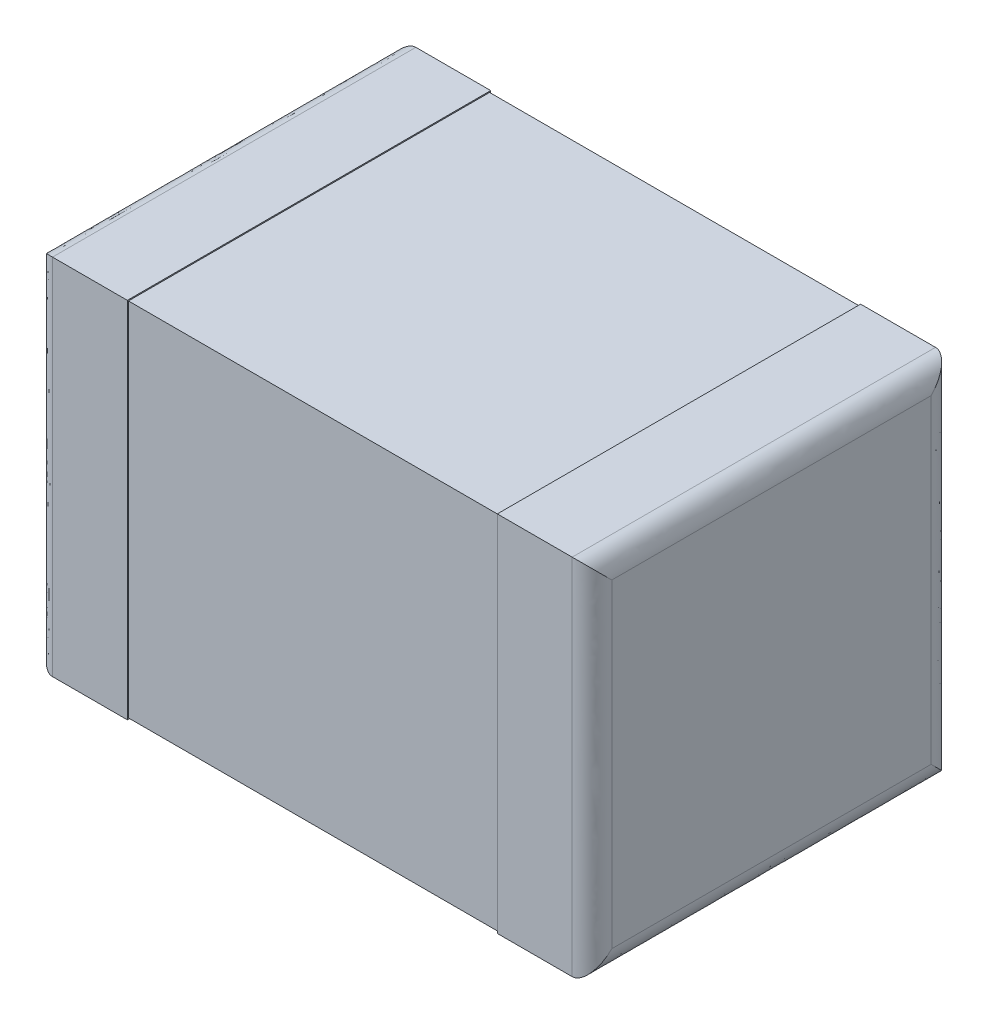
ISO-10303-21;
HEADER;
FILE_DESCRIPTION(('STEP AP214'),'2;1');
FILE_NAME('part.step','',(''),(''),'','','');
FILE_SCHEMA(('AUTOMOTIVE_DESIGN { 1 0 10303 214 1 1 1 1 }'));
ENDSEC;
DATA;
#1=APPLICATION_CONTEXT('core data for automotive mechanical design processes');
#2=APPLICATION_PROTOCOL_DEFINITION('international standard','automotive_design',2000,#1);
#3=PRODUCT_CONTEXT('',#1,'mechanical');
#4=PRODUCT('Part','Part','',(#3));
#5=PRODUCT_RELATED_PRODUCT_CATEGORY('part','',(#4));
#6=PRODUCT_DEFINITION_FORMATION('','',#4);
#7=PRODUCT_DEFINITION_CONTEXT('part definition',#1,'design');
#8=PRODUCT_DEFINITION('design','',#6,#7);
#9=PRODUCT_DEFINITION_SHAPE('','',#8);
#10=(LENGTH_UNIT() NAMED_UNIT(*) SI_UNIT(.MILLI.,.METRE.));
#11=(NAMED_UNIT(*) PLANE_ANGLE_UNIT() SI_UNIT($,.RADIAN.));
#12=(NAMED_UNIT(*) SI_UNIT($,.STERADIAN.) SOLID_ANGLE_UNIT());
#13=UNCERTAINTY_MEASURE_WITH_UNIT(LENGTH_MEASURE(1.E-05),#10,'distance_accuracy_value','');
#14=(GEOMETRIC_REPRESENTATION_CONTEXT(3) GLOBAL_UNCERTAINTY_ASSIGNED_CONTEXT((#13)) GLOBAL_UNIT_ASSIGNED_CONTEXT((#10,
#11,#12)) REPRESENTATION_CONTEXT('',''));
#15=CARTESIAN_POINT('',(0.,0.,0.));
#16=DIRECTION('',(0.,0.,1.));
#17=DIRECTION('',(1.,0.,0.));
#18=AXIS2_PLACEMENT_3D('',#15,#16,#17);
#19=CARTESIAN_POINT('',(1.23952,0.8382,0.838200109553));
#20=CARTESIAN_POINT('',(1.23952,0.8382,-1.095530181017E-07));
#21=CARTESIAN_POINT('',(1.28016,0.838199999999999,0.838200109553001));
#22=CARTESIAN_POINT('',(1.28016,0.838199999999999,-1.095530181017E-07));
#23=CARTESIAN_POINT('',(1.28016,0.7874,0.838200109553));
#24=CARTESIAN_POINT('',(1.28016,0.7874,-1.095530181017E-07));
#25=(BOUNDED_SURFACE() B_SPLINE_SURFACE(2,1,((#19,#20),(#21,#22),(#23,#24)),.UNSPECIFIED.,.F.,
.F.,.F.) B_SPLINE_SURFACE_WITH_KNOTS((3,3),(2,2),(1.570796326795,3.14159265359),
(-1.095530180276E-07,0.838200109553),
.UNSPECIFIED.) GEOMETRIC_REPRESENTATION_ITEM() RATIONAL_B_SPLINE_SURFACE(((1.,1.),
(0.707106781187,0.707106781187),(1.,1.))) REPRESENTATION_ITEM('') SURFACE());
#26=CARTESIAN_POINT('',(1.28016,0.7874,0.7874));
#27=CARTESIAN_POINT('',(1.28016,0.838199999999999,0.838199999999999));
#28=CARTESIAN_POINT('',(1.23952,0.8382,0.8382));
#29=(BOUNDED_CURVE() B_SPLINE_CURVE(2,(#26,#27,#28),.UNSPECIFIED.,.F.,
.F.) B_SPLINE_CURVE_WITH_KNOTS((3,3),(1.570796326795,3.14159265359),
.UNSPECIFIED.) CURVE() GEOMETRIC_REPRESENTATION_ITEM() RATIONAL_B_SPLINE_CURVE((1.,
0.707106781187,1.)) REPRESENTATION_ITEM(''));
#30=CARTESIAN_POINT('',(1.28016,0.7874,0.7874));
#31=VERTEX_POINT('',#30);
#32=CARTESIAN_POINT('',(1.23952,0.8382,0.8382));
#33=VERTEX_POINT('',#32);
#34=EDGE_CURVE('E27',#31,#33,#29,.T.);
#35=DIRECTION('',(0.,0.,-1.));
#36=VECTOR('',#35,1.);
#37=CARTESIAN_POINT('',(1.28016,0.7874,0.4191));
#38=LINE('',#37,#36);
#39=CARTESIAN_POINT('',(1.28016,0.7874,0.0508));
#40=VERTEX_POINT('',#39);
#41=EDGE_CURVE('E171',#31,#40,#38,.T.);
#42=CARTESIAN_POINT('',(1.28016,0.7874,0.0508));
#43=CARTESIAN_POINT('',(1.28016,0.838199999999999,0.));
#44=CARTESIAN_POINT('',(1.23952,0.8382,0.));
#45=(BOUNDED_CURVE() B_SPLINE_CURVE(2,(#42,#43,#44),.UNSPECIFIED.,.F.,
.F.) B_SPLINE_CURVE_WITH_KNOTS((3,3),(4.712388980385,6.28318530718),
.UNSPECIFIED.) CURVE() GEOMETRIC_REPRESENTATION_ITEM() RATIONAL_B_SPLINE_CURVE((1.,
0.707106781187,1.)) REPRESENTATION_ITEM(''));
#46=CARTESIAN_POINT('',(1.23952,0.8382,0.));
#47=VERTEX_POINT('',#46);
#48=EDGE_CURVE('E11',#40,#47,#45,.T.);
#49=DIRECTION('',(0.,0.,-1.));
#50=VECTOR('',#49,1.);
#51=CARTESIAN_POINT('',(1.23952,0.8382,0.4191));
#52=LINE('',#51,#50);
#53=EDGE_CURVE('E168',#33,#47,#52,.T.);
#54=ORIENTED_EDGE('',*,*,#34,.F.);
#55=ORIENTED_EDGE('',*,*,#41,.T.);
#56=ORIENTED_EDGE('',*,*,#48,.T.);
#57=ORIENTED_EDGE('',*,*,#53,.F.);
#58=EDGE_LOOP('',(#54,#55,#56,#57));
#59=FACE_BOUND('',#58,.T.);
#60=ADVANCED_FACE('F17',(#59),#25,.T.);
#61=CARTESIAN_POINT('',(1.28016,-1.095530180179E-07,0.0508));
#62=CARTESIAN_POINT('',(1.28016,0.838200109553,0.0508));
#63=CARTESIAN_POINT('',(1.28016,-1.095530180179E-07,0.));
#64=CARTESIAN_POINT('',(1.28016,0.838200109553001,0.));
#65=CARTESIAN_POINT('',(1.23952,-1.095530180179E-07,0.));
#66=CARTESIAN_POINT('',(1.23952,0.838200109553,0.));
#67=(BOUNDED_SURFACE() B_SPLINE_SURFACE(2,1,((#61,#62),(#63,#64),(#65,#66)),.UNSPECIFIED.,.F.,
.F.,.F.) B_SPLINE_SURFACE_WITH_KNOTS((3,3),(2,2),(1.570796326795,3.14159265359),
(-1.095530180179E-07,0.838200109553),
.UNSPECIFIED.) GEOMETRIC_REPRESENTATION_ITEM() RATIONAL_B_SPLINE_SURFACE(((1.,1.),
(0.707106781187,0.707106781187),(1.,1.))) REPRESENTATION_ITEM('') SURFACE());
#68=CARTESIAN_POINT('',(1.28016,0.0508,0.0508));
#69=CARTESIAN_POINT('',(1.28016,0.,0.));
#70=CARTESIAN_POINT('',(1.23952,0.,0.));
#71=(BOUNDED_CURVE() B_SPLINE_CURVE(2,(#68,#69,#70),.UNSPECIFIED.,.F.,
.F.) B_SPLINE_CURVE_WITH_KNOTS((3,3),(4.712388980385,6.28318530718),
.UNSPECIFIED.) CURVE() GEOMETRIC_REPRESENTATION_ITEM() RATIONAL_B_SPLINE_CURVE((1.,
0.707106781187,1.)) REPRESENTATION_ITEM(''));
#72=CARTESIAN_POINT('',(1.28016,0.0508,0.0508));
#73=VERTEX_POINT('',#72);
#74=CARTESIAN_POINT('',(1.23952,0.,0.));
#75=VERTEX_POINT('',#74);
#76=EDGE_CURVE('E189',#73,#75,#71,.T.);
#77=DIRECTION('',(0.,1.,0.));
#78=VECTOR('',#77,1.);
#79=CARTESIAN_POINT('',(1.23952,0.4191,0.));
#80=LINE('',#79,#78);
#81=EDGE_CURVE('E187',#75,#47,#80,.T.);
#82=DIRECTION('',(0.,1.,0.));
#83=VECTOR('',#82,1.);
#84=CARTESIAN_POINT('',(1.28016,0.4191,0.0508));
#85=LINE('',#84,#83);
#86=EDGE_CURVE('E367',#73,#40,#85,.T.);
#87=ORIENTED_EDGE('',*,*,#76,.T.);
#88=ORIENTED_EDGE('',*,*,#81,.T.);
#89=ORIENTED_EDGE('',*,*,#48,.F.);
#90=ORIENTED_EDGE('',*,*,#86,.F.);
#91=EDGE_LOOP('',(#87,#88,#89,#90));
#92=FACE_BOUND('',#91,.T.);
#93=ADVANCED_FACE('F188',(#92),#67,.T.);
#94=CARTESIAN_POINT('',(1.28016,0.838200109553,0.7874));
#95=CARTESIAN_POINT('',(1.28016,-1.095530180153E-07,0.7874));
#96=CARTESIAN_POINT('',(1.28016,0.838200109553001,0.838199999999999));
#97=CARTESIAN_POINT('',(1.28016,-1.095530180153E-07,0.838199999999999));
#98=CARTESIAN_POINT('',(1.23952,0.838200109553,0.8382));
#99=CARTESIAN_POINT('',(1.23952,-1.095530180153E-07,0.8382));
#100=(BOUNDED_SURFACE() B_SPLINE_SURFACE(2,1,((#94,#95),(#96,#97),(#98,#99)),.UNSPECIFIED.,.F.,
.F.,.F.) B_SPLINE_SURFACE_WITH_KNOTS((3,3),(2,2),(1.570796326795,3.14159265359),
(-0.838200109553,1.095530180153E-07),
.UNSPECIFIED.) GEOMETRIC_REPRESENTATION_ITEM() RATIONAL_B_SPLINE_SURFACE(((1.,1.),
(0.707106781187,0.707106781187),(1.,1.))) REPRESENTATION_ITEM('') SURFACE());
#101=CARTESIAN_POINT('',(1.28016,0.0508,0.7874));
#102=CARTESIAN_POINT('',(1.28016,0.,0.838199999999999));
#103=CARTESIAN_POINT('',(1.23952,0.,0.8382));
#104=(BOUNDED_CURVE() B_SPLINE_CURVE(2,(#101,#102,#103),.UNSPECIFIED.,.F.,
.F.) B_SPLINE_CURVE_WITH_KNOTS((3,3),(1.570796326795,3.14159265359),
.UNSPECIFIED.) CURVE() GEOMETRIC_REPRESENTATION_ITEM() RATIONAL_B_SPLINE_CURVE((1.,
0.707106781187,1.)) REPRESENTATION_ITEM(''));
#105=CARTESIAN_POINT('',(1.28016,0.0508,0.7874));
#106=VERTEX_POINT('',#105);
#107=CARTESIAN_POINT('',(1.23952,0.,0.8382));
#108=VERTEX_POINT('',#107);
#109=EDGE_CURVE('E40',#106,#108,#104,.T.);
#110=DIRECTION('',(0.,1.,0.));
#111=VECTOR('',#110,1.);
#112=CARTESIAN_POINT('',(1.28016,0.4191,0.7874));
#113=LINE('',#112,#111);
#114=EDGE_CURVE('E277',#106,#31,#113,.T.);
#115=DIRECTION('',(0.,1.,0.));
#116=VECTOR('',#115,1.);
#117=CARTESIAN_POINT('',(1.23952,0.4191,0.8382));
#118=LINE('',#117,#116);
#119=EDGE_CURVE('E339',#108,#33,#118,.T.);
#120=ORIENTED_EDGE('',*,*,#109,.F.);
#121=ORIENTED_EDGE('',*,*,#114,.T.);
#122=ORIENTED_EDGE('',*,*,#34,.T.);
#123=ORIENTED_EDGE('',*,*,#119,.F.);
#124=EDGE_LOOP('',(#120,#121,#122,#123));
#125=FACE_BOUND('',#124,.T.);
#126=ADVANCED_FACE('F641',(#125),#100,.T.);
#127=CARTESIAN_POINT('',(1.28016,0.0508,0.838200109553));
#128=CARTESIAN_POINT('',(1.28016,0.0508,-1.095530181017E-07));
#129=CARTESIAN_POINT('',(1.28016,0.,0.838200109553001));
#130=CARTESIAN_POINT('',(1.28016,0.,-1.095530181017E-07));
#131=CARTESIAN_POINT('',(1.23952,0.,0.838200109553));
#132=CARTESIAN_POINT('',(1.23952,0.,-1.095530181017E-07));
#133=(BOUNDED_SURFACE() B_SPLINE_SURFACE(2,1,((#127,#128),(#129,#130),(#131,#132)),
.UNSPECIFIED.,.F.,.F.,.F.) B_SPLINE_SURFACE_WITH_KNOTS((3,3),(2,2),(3.14159265359,
4.712388980385),(-1.095530180276E-07,0.838200109553),
.UNSPECIFIED.) GEOMETRIC_REPRESENTATION_ITEM() RATIONAL_B_SPLINE_SURFACE(((1.,1.),
(0.707106781187,0.707106781187),(1.,1.))) REPRESENTATION_ITEM('') SURFACE());
#134=DIRECTION('',(0.,0.,-1.));
#135=VECTOR('',#134,1.);
#136=CARTESIAN_POINT('',(1.28016,0.0508,0.4191));
#137=LINE('',#136,#135);
#138=EDGE_CURVE('E280',#106,#73,#137,.T.);
#139=DIRECTION('',(0.,0.,-1.));
#140=VECTOR('',#139,1.);
#141=CARTESIAN_POINT('',(1.23952,0.,0.4191));
#142=LINE('',#141,#140);
#143=EDGE_CURVE('E225',#108,#75,#142,.T.);
#144=ORIENTED_EDGE('',*,*,#76,.F.);
#145=ORIENTED_EDGE('',*,*,#138,.F.);
#146=ORIENTED_EDGE('',*,*,#109,.T.);
#147=ORIENTED_EDGE('',*,*,#143,.T.);
#148=EDGE_LOOP('',(#144,#145,#146,#147));
#149=FACE_BOUND('',#148,.T.);
#150=ADVANCED_FACE('F630',(#149),#133,.T.);
#151=CARTESIAN_POINT('',(0.04064,0.,0.838200109553));
#152=CARTESIAN_POINT('',(0.04064,0.,-1.095530181017E-07));
#153=CARTESIAN_POINT('',(0.,0.,0.838200109553001));
#154=CARTESIAN_POINT('',(0.,0.,-1.095530181017E-07));
#155=CARTESIAN_POINT('',(0.,0.0508,0.838200109553));
#156=CARTESIAN_POINT('',(0.,0.0508,-1.095530181017E-07));
#157=(BOUNDED_SURFACE() B_SPLINE_SURFACE(2,1,((#151,#152),(#153,#154),(#155,#156)),
.UNSPECIFIED.,.F.,.F.,.F.) B_SPLINE_SURFACE_WITH_KNOTS((3,3),(2,2),(4.712388980385,
6.28318530718),(-1.095530180276E-07,0.838200109553),
.UNSPECIFIED.) GEOMETRIC_REPRESENTATION_ITEM() RATIONAL_B_SPLINE_SURFACE(((1.,1.),
(0.707106781187,0.707106781187),(1.,1.))) REPRESENTATION_ITEM('') SURFACE());
#158=CARTESIAN_POINT('',(0.,0.0508,0.7874));
#159=CARTESIAN_POINT('',(0.,0.,0.838199999999999));
#160=CARTESIAN_POINT('',(0.04064,0.,0.8382));
#161=(BOUNDED_CURVE() B_SPLINE_CURVE(2,(#158,#159,#160),.UNSPECIFIED.,.F.,
.F.) B_SPLINE_CURVE_WITH_KNOTS((3,3),(1.570796326795,3.14159265359),
.UNSPECIFIED.) CURVE() GEOMETRIC_REPRESENTATION_ITEM() RATIONAL_B_SPLINE_CURVE((1.,
0.707106781187,1.)) REPRESENTATION_ITEM(''));
#162=CARTESIAN_POINT('',(0.,0.0508,0.7874));
#163=VERTEX_POINT('',#162);
#164=CARTESIAN_POINT('',(0.04064,0.,0.8382));
#165=VERTEX_POINT('',#164);
#166=EDGE_CURVE('E400',#163,#165,#161,.T.);
#167=DIRECTION('',(0.,0.,-1.));
#168=VECTOR('',#167,1.);
#169=CARTESIAN_POINT('',(0.,0.0508,0.4191));
#170=LINE('',#169,#168);
#171=CARTESIAN_POINT('',(0.,0.0508,0.0508));
#172=VERTEX_POINT('',#171);
#173=EDGE_CURVE('E330',#163,#172,#170,.T.);
#174=CARTESIAN_POINT('',(0.,0.0508,0.0508));
#175=CARTESIAN_POINT('',(0.,0.,0.));
#176=CARTESIAN_POINT('',(0.04064,0.,0.));
#177=(BOUNDED_CURVE() B_SPLINE_CURVE(2,(#174,#175,#176),.UNSPECIFIED.,.F.,
.F.) B_SPLINE_CURVE_WITH_KNOTS((3,3),(4.712388980385,6.28318530718),
.UNSPECIFIED.) CURVE() GEOMETRIC_REPRESENTATION_ITEM() RATIONAL_B_SPLINE_CURVE((1.,
0.707106781187,1.)) REPRESENTATION_ITEM(''));
#178=CARTESIAN_POINT('',(0.04064,0.,0.));
#179=VERTEX_POINT('',#178);
#180=EDGE_CURVE('E377',#172,#179,#177,.T.);
#181=DIRECTION('',(0.,0.,-1.));
#182=VECTOR('',#181,1.);
#183=CARTESIAN_POINT('',(0.04064,0.,0.4191));
#184=LINE('',#183,#182);
#185=EDGE_CURVE('E235',#165,#179,#184,.T.);
#186=ORIENTED_EDGE('',*,*,#166,.F.);
#187=ORIENTED_EDGE('',*,*,#173,.T.);
#188=ORIENTED_EDGE('',*,*,#180,.T.);
#189=ORIENTED_EDGE('',*,*,#185,.F.);
#190=EDGE_LOOP('',(#186,#187,#188,#189));
#191=FACE_BOUND('',#190,.T.);
#192=ADVANCED_FACE('F619',(#191),#157,.T.);
#193=CARTESIAN_POINT('',(0.,0.838200109553,0.0508));
#194=CARTESIAN_POINT('',(0.,-1.095530181017E-07,0.0508));
#195=CARTESIAN_POINT('',(0.,0.838200109553001,0.));
#196=CARTESIAN_POINT('',(0.,-1.095530181017E-07,0.));
#197=CARTESIAN_POINT('',(0.04064,0.838200109553,0.));
#198=CARTESIAN_POINT('',(0.04064,-1.095530181017E-07,0.));
#199=(BOUNDED_SURFACE() B_SPLINE_SURFACE(2,1,((#193,#194),(#195,#196),(#197,#198)),
.UNSPECIFIED.,.F.,.F.,.F.) B_SPLINE_SURFACE_WITH_KNOTS((3,3),(2,2),(3.14159265359,
4.712388980385),(-1.095530180288E-07,0.838200109553),
.UNSPECIFIED.) GEOMETRIC_REPRESENTATION_ITEM() RATIONAL_B_SPLINE_SURFACE(((1.,1.),
(0.707106781187,0.707106781187),(1.,1.))) REPRESENTATION_ITEM('') SURFACE());
#200=CARTESIAN_POINT('',(0.,0.7874,0.0508));
#201=CARTESIAN_POINT('',(0.,0.838199999999999,0.));
#202=CARTESIAN_POINT('',(0.04064,0.8382,0.));
#203=(BOUNDED_CURVE() B_SPLINE_CURVE(2,(#200,#201,#202),.UNSPECIFIED.,.F.,
.F.) B_SPLINE_CURVE_WITH_KNOTS((3,3),(4.712388980385,6.28318530718),
.UNSPECIFIED.) CURVE() GEOMETRIC_REPRESENTATION_ITEM() RATIONAL_B_SPLINE_CURVE((1.,
0.707106781187,1.)) REPRESENTATION_ITEM(''));
#204=CARTESIAN_POINT('',(0.,0.7874,0.0508));
#205=VERTEX_POINT('',#204);
#206=CARTESIAN_POINT('',(0.04064,0.8382,0.));
#207=VERTEX_POINT('',#206);
#208=EDGE_CURVE('E353',#205,#207,#203,.T.);
#209=DIRECTION('',(0.,-1.,0.));
#210=VECTOR('',#209,1.);
#211=CARTESIAN_POINT('',(0.04064,0.4191,0.));
#212=LINE('',#211,#210);
#213=EDGE_CURVE('E223',#207,#179,#212,.T.);
#214=DIRECTION('',(0.,-1.,0.));
#215=VECTOR('',#214,1.);
#216=CARTESIAN_POINT('',(0.,0.4191,0.0508));
#217=LINE('',#216,#215);
#218=EDGE_CURVE('E326',#205,#172,#217,.T.);
#219=ORIENTED_EDGE('',*,*,#208,.T.);
#220=ORIENTED_EDGE('',*,*,#213,.T.);
#221=ORIENTED_EDGE('',*,*,#180,.F.);
#222=ORIENTED_EDGE('',*,*,#218,.F.);
#223=EDGE_LOOP('',(#219,#220,#221,#222));
#224=FACE_BOUND('',#223,.T.);
#225=ADVANCED_FACE('F608',(#224),#199,.T.);
#226=CARTESIAN_POINT('',(0.,-1.095530180156E-07,0.7874));
#227=CARTESIAN_POINT('',(0.,0.838200109553,0.7874));
#228=CARTESIAN_POINT('',(0.,-1.095530180156E-07,0.838199999999999));
#229=CARTESIAN_POINT('',(0.,0.838200109553001,0.838199999999999));
#230=CARTESIAN_POINT('',(0.04064,-1.095530180153E-07,0.8382));
#231=CARTESIAN_POINT('',(0.04064,0.838200109553,0.8382));
#232=(BOUNDED_SURFACE() B_SPLINE_SURFACE(2,1,((#226,#227),(#228,#229),(#230,#231)),
.UNSPECIFIED.,.F.,.F.,.F.) B_SPLINE_SURFACE_WITH_KNOTS((3,3),(2,2),(0.,1.570796326795),
(-1.095530180156E-07,0.838200109553),
.UNSPECIFIED.) GEOMETRIC_REPRESENTATION_ITEM() RATIONAL_B_SPLINE_SURFACE(((1.,1.),
(0.707106781187,0.707106781187),(1.,1.))) REPRESENTATION_ITEM('') SURFACE());
#233=CARTESIAN_POINT('',(0.,0.7874,0.7874));
#234=CARTESIAN_POINT('',(0.,0.838199999999999,0.838199999999999));
#235=CARTESIAN_POINT('',(0.04064,0.8382,0.8382));
#236=(BOUNDED_CURVE() B_SPLINE_CURVE(2,(#233,#234,#235),.UNSPECIFIED.,.F.,
.F.) B_SPLINE_CURVE_WITH_KNOTS((3,3),(1.570796326795,3.14159265359),
.UNSPECIFIED.) CURVE() GEOMETRIC_REPRESENTATION_ITEM() RATIONAL_B_SPLINE_CURVE((1.,
0.707106781187,1.)) REPRESENTATION_ITEM(''));
#237=CARTESIAN_POINT('',(0.,0.7874,0.7874));
#238=VERTEX_POINT('',#237);
#239=CARTESIAN_POINT('',(0.04064,0.8382,0.8382));
#240=VERTEX_POINT('',#239);
#241=EDGE_CURVE('E356',#238,#240,#236,.T.);
#242=DIRECTION('',(0.,-1.,0.));
#243=VECTOR('',#242,1.);
#244=CARTESIAN_POINT('',(0.,0.4191,0.7874));
#245=LINE('',#244,#243);
#246=EDGE_CURVE('E351',#238,#163,#245,.T.);
#247=DIRECTION('',(0.,-1.,0.));
#248=VECTOR('',#247,1.);
#249=CARTESIAN_POINT('',(0.04064,0.4191,0.8382));
#250=LINE('',#249,#248);
#251=EDGE_CURVE('E242',#240,#165,#250,.T.);
#252=ORIENTED_EDGE('',*,*,#241,.F.);
#253=ORIENTED_EDGE('',*,*,#246,.T.);
#254=ORIENTED_EDGE('',*,*,#166,.T.);
#255=ORIENTED_EDGE('',*,*,#251,.F.);
#256=EDGE_LOOP('',(#252,#253,#254,#255));
#257=FACE_BOUND('',#256,.T.);
#258=ADVANCED_FACE('F597',(#257),#232,.T.);
#259=CARTESIAN_POINT('',(0.,0.7874,0.838200109553));
#260=CARTESIAN_POINT('',(0.,0.7874,-1.095530181017E-07));
#261=CARTESIAN_POINT('',(0.,0.838199999999999,0.838200109553001));
#262=CARTESIAN_POINT('',(0.,0.838199999999999,-1.095530181017E-07));
#263=CARTESIAN_POINT('',(0.04064,0.8382,0.838200109553));
#264=CARTESIAN_POINT('',(0.04064,0.8382,-1.095530181017E-07));
#265=(BOUNDED_SURFACE() B_SPLINE_SURFACE(2,1,((#259,#260),(#261,#262),(#263,#264)),
.UNSPECIFIED.,.F.,.F.,.F.) B_SPLINE_SURFACE_WITH_KNOTS((3,3),(2,2),(0.,1.570796326795),
(-1.095530180276E-07,0.838200109553),
.UNSPECIFIED.) GEOMETRIC_REPRESENTATION_ITEM() RATIONAL_B_SPLINE_SURFACE(((1.,1.),
(0.707106781187,0.707106781187),(1.,1.))) REPRESENTATION_ITEM('') SURFACE());
#266=DIRECTION('',(0.,0.,-1.));
#267=VECTOR('',#266,1.);
#268=CARTESIAN_POINT('',(0.,0.7874,0.4191));
#269=LINE('',#268,#267);
#270=EDGE_CURVE('E362',#238,#205,#269,.T.);
#271=DIRECTION('',(0.,0.,-1.));
#272=VECTOR('',#271,1.);
#273=CARTESIAN_POINT('',(0.04064,0.8382,0.4191));
#274=LINE('',#273,#272);
#275=EDGE_CURVE('E315',#240,#207,#274,.T.);
#276=ORIENTED_EDGE('',*,*,#208,.F.);
#277=ORIENTED_EDGE('',*,*,#270,.F.);
#278=ORIENTED_EDGE('',*,*,#241,.T.);
#279=ORIENTED_EDGE('',*,*,#275,.T.);
#280=EDGE_LOOP('',(#276,#277,#278,#279));
#281=FACE_BOUND('',#280,.T.);
#282=ADVANCED_FACE('F536',(#281),#265,.T.);
#283=CARTESIAN_POINT('',(1.0668,0.00254,0.00254));
#284=DIRECTION('',(0.,0.,-1.));
#285=DIRECTION('',(-1.,0.,0.));
#286=AXIS2_PLACEMENT_3D('',#283,#284,#285);
#287=PLANE('',#286);
#288=DIRECTION('',(-1.,0.,0.));
#289=VECTOR('',#288,1.);
#290=CARTESIAN_POINT('',(0.64008,0.00254,0.00254));
#291=LINE('',#290,#289);
#292=CARTESIAN_POINT('',(1.0668,0.00254,0.00254));
#293=VERTEX_POINT('',#292);
#294=CARTESIAN_POINT('',(0.21336,0.00254,0.00254));
#295=VERTEX_POINT('',#294);
#296=EDGE_CURVE('E261',#293,#295,#291,.T.);
#297=ORIENTED_EDGE('',*,*,#296,.T.);
#298=DIRECTION('',(0.,-1.,0.));
#299=VECTOR('',#298,1.);
#300=CARTESIAN_POINT('',(0.21336,0.4191,0.00254));
#301=LINE('',#300,#299);
#302=CARTESIAN_POINT('',(0.21336,0.83566,0.00254));
#303=VERTEX_POINT('',#302);
#304=EDGE_CURVE('E382',#303,#295,#301,.T.);
#305=ORIENTED_EDGE('',*,*,#304,.F.);
#306=DIRECTION('',(1.,0.,0.));
#307=VECTOR('',#306,1.);
#308=CARTESIAN_POINT('',(0.64008,0.83566,0.00254));
#309=LINE('',#308,#307);
#310=CARTESIAN_POINT('',(1.0668,0.83566,0.00254));
#311=VERTEX_POINT('',#310);
#312=EDGE_CURVE('E217',#303,#311,#309,.T.);
#313=ORIENTED_EDGE('',*,*,#312,.T.);
#314=DIRECTION('',(0.,-1.,0.));
#315=VECTOR('',#314,1.);
#316=CARTESIAN_POINT('',(1.0668,0.4191,0.00254));
#317=LINE('',#316,#315);
#318=EDGE_CURVE('E390',#311,#293,#317,.T.);
#319=ORIENTED_EDGE('',*,*,#318,.T.);
#320=EDGE_LOOP('',(#297,#305,#313,#319));
#321=FACE_BOUND('',#320,.T.);
#322=ADVANCED_FACE('F464',(#321),#287,.T.);
#323=CARTESIAN_POINT('',(1.0668,0.00254,0.83566));
#324=DIRECTION('',(0.,0.,-1.));
#325=DIRECTION('',(-1.,0.,0.));
#326=AXIS2_PLACEMENT_3D('',#323,#324,#325);
#327=PLANE('',#326);
#328=DIRECTION('',(0.,-1.,0.));
#329=VECTOR('',#328,1.);
#330=CARTESIAN_POINT('',(1.0668,0.4191,0.83566));
#331=LINE('',#330,#329);
#332=CARTESIAN_POINT('',(1.0668,0.83566,0.83566));
#333=VERTEX_POINT('',#332);
#334=CARTESIAN_POINT('',(1.0668,0.00254,0.83566));
#335=VERTEX_POINT('',#334);
#336=EDGE_CURVE('E357',#333,#335,#331,.T.);
#337=ORIENTED_EDGE('',*,*,#336,.F.);
#338=DIRECTION('',(1.,0.,0.));
#339=VECTOR('',#338,1.);
#340=CARTESIAN_POINT('',(0.64008,0.83566,0.83566));
#341=LINE('',#340,#339);
#342=CARTESIAN_POINT('',(0.21336,0.83566,0.83566));
#343=VERTEX_POINT('',#342);
#344=EDGE_CURVE('E290',#343,#333,#341,.T.);
#345=ORIENTED_EDGE('',*,*,#344,.F.);
#346=DIRECTION('',(0.,1.,0.));
#347=VECTOR('',#346,1.);
#348=CARTESIAN_POINT('',(0.21336,0.4191,0.83566));
#349=LINE('',#348,#347);
#350=CARTESIAN_POINT('',(0.21336,0.00254,0.83566));
#351=VERTEX_POINT('',#350);
#352=EDGE_CURVE('E386',#351,#343,#349,.T.);
#353=ORIENTED_EDGE('',*,*,#352,.F.);
#354=DIRECTION('',(-1.,0.,0.));
#355=VECTOR('',#354,1.);
#356=CARTESIAN_POINT('',(0.64008,0.00254,0.83566));
#357=LINE('',#356,#355);
#358=EDGE_CURVE('E218',#335,#351,#357,.T.);
#359=ORIENTED_EDGE('',*,*,#358,.F.);
#360=EDGE_LOOP('',(#337,#345,#353,#359));
#361=FACE_BOUND('',#360,.T.);
#362=ADVANCED_FACE('F458',(#361),#327,.F.);
#363=CARTESIAN_POINT('',(1.0668,0.,0.));
#364=DIRECTION('',(-1.,0.,0.));
#365=DIRECTION('',(0.,0.,1.));
#366=AXIS2_PLACEMENT_3D('',#363,#364,#365);
#367=PLANE('',#366);
#368=DIRECTION('',(0.,0.,1.));
#369=VECTOR('',#368,1.);
#370=CARTESIAN_POINT('',(1.0668,0.,0.4191));
#371=LINE('',#370,#369);
#372=CARTESIAN_POINT('',(1.0668,0.,0.));
#373=VERTEX_POINT('',#372);
#374=CARTESIAN_POINT('',(1.0668,0.,0.8382));
#375=VERTEX_POINT('',#374);
#376=EDGE_CURVE('E310',#373,#375,#371,.T.);
#377=ORIENTED_EDGE('',*,*,#376,.T.);
#378=DIRECTION('',(0.,-1.,0.));
#379=VECTOR('',#378,1.);
#380=CARTESIAN_POINT('',(1.0668,0.4191,0.8382));
#381=LINE('',#380,#379);
#382=CARTESIAN_POINT('',(1.0668,0.8382,0.8382));
#383=VERTEX_POINT('',#382);
#384=EDGE_CURVE('E331',#383,#375,#381,.T.);
#385=ORIENTED_EDGE('',*,*,#384,.F.);
#386=DIRECTION('',(0.,0.,1.));
#387=VECTOR('',#386,1.);
#388=CARTESIAN_POINT('',(1.0668,0.8382,0.4191));
#389=LINE('',#388,#387);
#390=CARTESIAN_POINT('',(1.0668,0.8382,0.));
#391=VERTEX_POINT('',#390);
#392=EDGE_CURVE('E184',#391,#383,#389,.T.);
#393=ORIENTED_EDGE('',*,*,#392,.F.);
#394=DIRECTION('',(0.,1.,0.));
#395=VECTOR('',#394,1.);
#396=CARTESIAN_POINT('',(1.0668,0.4191,0.));
#397=LINE('',#396,#395);
#398=EDGE_CURVE('E197',#373,#391,#397,.T.);
#399=ORIENTED_EDGE('',*,*,#398,.F.);
#400=EDGE_LOOP('',(#377,#385,#393,#399));
#401=FACE_BOUND('',#400,.T.);
#402=ORIENTED_EDGE('',*,*,#318,.F.);
#403=DIRECTION('',(0.,0.,1.));
#404=VECTOR('',#403,1.);
#405=CARTESIAN_POINT('',(1.0668,0.83566,0.4191));
#406=LINE('',#405,#404);
#407=EDGE_CURVE('E294',#311,#333,#406,.T.);
#408=ORIENTED_EDGE('',*,*,#407,.T.);
#409=ORIENTED_EDGE('',*,*,#336,.T.);
#410=DIRECTION('',(0.,0.,1.));
#411=VECTOR('',#410,1.);
#412=CARTESIAN_POINT('',(1.0668,0.00254,0.4191));
#413=LINE('',#412,#411);
#414=EDGE_CURVE('E263',#293,#335,#413,.T.);
#415=ORIENTED_EDGE('',*,*,#414,.F.);
#416=EDGE_LOOP('',(#402,#408,#409,#415));
#417=FACE_BOUND('',#416,.T.);
#418=ADVANCED_FACE('F463',(#401,#417),#367,.T.);
#419=CARTESIAN_POINT('',(0.21336,0.,0.));
#420=DIRECTION('',(1.,0.,0.));
#421=DIRECTION('',(0.,1.,0.));
#422=AXIS2_PLACEMENT_3D('',#419,#420,#421);
#423=PLANE('',#422);
#424=DIRECTION('',(0.,0.,1.));
#425=VECTOR('',#424,1.);
#426=CARTESIAN_POINT('',(0.21336,0.8382,0.4191));
#427=LINE('',#426,#425);
#428=CARTESIAN_POINT('',(0.21336,0.8382,0.));
#429=VERTEX_POINT('',#428);
#430=CARTESIAN_POINT('',(0.21336,0.8382,0.8382));
#431=VERTEX_POINT('',#430);
#432=EDGE_CURVE('E247',#429,#431,#427,.T.);
#433=ORIENTED_EDGE('',*,*,#432,.T.);
#434=DIRECTION('',(0.,1.,0.));
#435=VECTOR('',#434,1.);
#436=CARTESIAN_POINT('',(0.21336,0.4191,0.8382));
#437=LINE('',#436,#435);
#438=CARTESIAN_POINT('',(0.21336,0.,0.8382));
#439=VERTEX_POINT('',#438);
#440=EDGE_CURVE('E246',#439,#431,#437,.T.);
#441=ORIENTED_EDGE('',*,*,#440,.F.);
#442=DIRECTION('',(0.,0.,1.));
#443=VECTOR('',#442,1.);
#444=CARTESIAN_POINT('',(0.21336,0.,0.4191));
#445=LINE('',#444,#443);
#446=CARTESIAN_POINT('',(0.21336,0.,0.));
#447=VERTEX_POINT('',#446);
#448=EDGE_CURVE('E229',#447,#439,#445,.T.);
#449=ORIENTED_EDGE('',*,*,#448,.F.);
#450=DIRECTION('',(0.,-1.,0.));
#451=VECTOR('',#450,1.);
#452=CARTESIAN_POINT('',(0.21336,0.4191,0.));
#453=LINE('',#452,#451);
#454=EDGE_CURVE('E252',#429,#447,#453,.T.);
#455=ORIENTED_EDGE('',*,*,#454,.F.);
#456=EDGE_LOOP('',(#433,#441,#449,#455));
#457=FACE_BOUND('',#456,.T.);
#458=DIRECTION('',(0.,0.,1.));
#459=VECTOR('',#458,1.);
#460=CARTESIAN_POINT('',(0.21336,0.83566,0.4191));
#461=LINE('',#460,#459);
#462=EDGE_CURVE('E285',#303,#343,#461,.T.);
#463=ORIENTED_EDGE('',*,*,#462,.F.);
#464=ORIENTED_EDGE('',*,*,#304,.T.);
#465=DIRECTION('',(0.,0.,1.));
#466=VECTOR('',#465,1.);
#467=CARTESIAN_POINT('',(0.21336,0.00254,0.4191));
#468=LINE('',#467,#466);
#469=EDGE_CURVE('E213',#295,#351,#468,.T.);
#470=ORIENTED_EDGE('',*,*,#469,.T.);
#471=ORIENTED_EDGE('',*,*,#352,.T.);
#472=EDGE_LOOP('',(#463,#464,#470,#471));
#473=FACE_BOUND('',#472,.T.);
#474=ADVANCED_FACE('F449',(#457,#473),#423,.T.);
#475=CARTESIAN_POINT('',(1.28016,0.0508,0.0508));
#476=DIRECTION('',(-1.,0.,0.));
#477=DIRECTION('',(0.,0.,1.));
#478=AXIS2_PLACEMENT_3D('',#475,#476,#477);
#479=PLANE('',#478);
#480=ORIENTED_EDGE('',*,*,#86,.T.);
#481=ORIENTED_EDGE('',*,*,#41,.F.);
#482=ORIENTED_EDGE('',*,*,#114,.F.);
#483=ORIENTED_EDGE('',*,*,#138,.T.);
#484=EDGE_LOOP('',(#480,#481,#482,#483));
#485=FACE_BOUND('',#484,.T.);
#486=ADVANCED_FACE('F443',(#485),#479,.F.);
#487=CARTESIAN_POINT('',(0.,0.0508,0.0508));
#488=DIRECTION('',(1.,0.,0.));
#489=DIRECTION('',(0.,1.,0.));
#490=AXIS2_PLACEMENT_3D('',#487,#488,#489);
#491=PLANE('',#490);
#492=ORIENTED_EDGE('',*,*,#218,.T.);
#493=ORIENTED_EDGE('',*,*,#173,.F.);
#494=ORIENTED_EDGE('',*,*,#246,.F.);
#495=ORIENTED_EDGE('',*,*,#270,.T.);
#496=EDGE_LOOP('',(#492,#493,#494,#495));
#497=FACE_BOUND('',#496,.T.);
#498=ADVANCED_FACE('F448',(#497),#491,.F.);
#499=CARTESIAN_POINT('',(1.0668,0.,0.8382));
#500=DIRECTION('',(0.,0.,1.));
#501=DIRECTION('',(1.,0.,0.));
#502=AXIS2_PLACEMENT_3D('',#499,#500,#501);
#503=PLANE('',#502);
#504=DIRECTION('',(1.,0.,0.));
#505=VECTOR('',#504,1.);
#506=CARTESIAN_POINT('',(1.15316,0.,0.8382));
#507=LINE('',#506,#505);
#508=EDGE_CURVE('E228',#375,#108,#507,.T.);
#509=ORIENTED_EDGE('',*,*,#508,.T.);
#510=ORIENTED_EDGE('',*,*,#119,.T.);
#511=DIRECTION('',(-1.,0.,0.));
#512=VECTOR('',#511,1.);
#513=CARTESIAN_POINT('',(1.15316,0.8382,0.8382));
#514=LINE('',#513,#512);
#515=EDGE_CURVE('E182',#33,#383,#514,.T.);
#516=ORIENTED_EDGE('',*,*,#515,.T.);
#517=ORIENTED_EDGE('',*,*,#384,.T.);
#518=EDGE_LOOP('',(#509,#510,#516,#517));
#519=FACE_BOUND('',#518,.T.);
#520=ADVANCED_FACE('F559',(#519),#503,.T.);
#521=CARTESIAN_POINT('',(0.04064,0.,0.8382));
#522=DIRECTION('',(0.,0.,1.));
#523=DIRECTION('',(1.,0.,0.));
#524=AXIS2_PLACEMENT_3D('',#521,#522,#523);
#525=PLANE('',#524);
#526=DIRECTION('',(-1.,0.,0.));
#527=VECTOR('',#526,1.);
#528=CARTESIAN_POINT('',(0.127,0.8382,0.8382));
#529=LINE('',#528,#527);
#530=EDGE_CURVE('E320',#431,#240,#529,.T.);
#531=ORIENTED_EDGE('',*,*,#530,.T.);
#532=ORIENTED_EDGE('',*,*,#251,.T.);
#533=DIRECTION('',(1.,0.,0.));
#534=VECTOR('',#533,1.);
#535=CARTESIAN_POINT('',(0.127,0.,0.8382));
#536=LINE('',#535,#534);
#537=EDGE_CURVE('E231',#165,#439,#536,.T.);
#538=ORIENTED_EDGE('',*,*,#537,.T.);
#539=ORIENTED_EDGE('',*,*,#440,.T.);
#540=EDGE_LOOP('',(#531,#532,#538,#539));
#541=FACE_BOUND('',#540,.T.);
#542=ADVANCED_FACE('F548',(#541),#525,.T.);
#543=CARTESIAN_POINT('',(0.04064,0.8382,0.));
#544=DIRECTION('',(0.,-1.,0.));
#545=DIRECTION('',(1.,0.,0.));
#546=AXIS2_PLACEMENT_3D('',#543,#544,#545);
#547=PLANE('',#546);
#548=DIRECTION('',(-1.,0.,0.));
#549=VECTOR('',#548,1.);
#550=CARTESIAN_POINT('',(0.127,0.8382,0.));
#551=LINE('',#550,#549);
#552=EDGE_CURVE('E240',#429,#207,#551,.T.);
#553=ORIENTED_EDGE('',*,*,#552,.T.);
#554=ORIENTED_EDGE('',*,*,#275,.F.);
#555=ORIENTED_EDGE('',*,*,#530,.F.);
#556=ORIENTED_EDGE('',*,*,#432,.F.);
#557=EDGE_LOOP('',(#553,#554,#555,#556));
#558=FACE_BOUND('',#557,.T.);
#559=ADVANCED_FACE('F422',(#558),#547,.F.);
#560=CARTESIAN_POINT('',(1.0668,0.,0.));
#561=DIRECTION('',(0.,1.,0.));
#562=DIRECTION('',(0.,0.,1.));
#563=AXIS2_PLACEMENT_3D('',#560,#561,#562);
#564=PLANE('',#563);
#565=DIRECTION('',(1.,0.,0.));
#566=VECTOR('',#565,1.);
#567=CARTESIAN_POINT('',(1.15316,0.,0.));
#568=LINE('',#567,#566);
#569=EDGE_CURVE('E194',#373,#75,#568,.T.);
#570=ORIENTED_EDGE('',*,*,#569,.T.);
#571=ORIENTED_EDGE('',*,*,#143,.F.);
#572=ORIENTED_EDGE('',*,*,#508,.F.);
#573=ORIENTED_EDGE('',*,*,#376,.F.);
#574=EDGE_LOOP('',(#570,#571,#572,#573));
#575=FACE_BOUND('',#574,.T.);
#576=ADVANCED_FACE('F415',(#575),#564,.F.);
#577=CARTESIAN_POINT('',(0.04064,0.,0.));
#578=DIRECTION('',(0.,1.,0.));
#579=DIRECTION('',(0.,0.,1.));
#580=AXIS2_PLACEMENT_3D('',#577,#578,#579);
#581=PLANE('',#580);
#582=ORIENTED_EDGE('',*,*,#537,.F.);
#583=ORIENTED_EDGE('',*,*,#185,.T.);
#584=DIRECTION('',(1.,0.,0.));
#585=VECTOR('',#584,1.);
#586=CARTESIAN_POINT('',(0.127,0.,0.));
#587=LINE('',#586,#585);
#588=EDGE_CURVE('E211',#179,#447,#587,.T.);
#589=ORIENTED_EDGE('',*,*,#588,.T.);
#590=ORIENTED_EDGE('',*,*,#448,.T.);
#591=EDGE_LOOP('',(#582,#583,#589,#590));
#592=FACE_BOUND('',#591,.T.);
#593=ADVANCED_FACE('F421',(#592),#581,.F.);
#594=CARTESIAN_POINT('',(1.0668,0.8382,0.));
#595=DIRECTION('',(0.,-1.,0.));
#596=DIRECTION('',(1.,0.,0.));
#597=AXIS2_PLACEMENT_3D('',#594,#595,#596);
#598=PLANE('',#597);
#599=ORIENTED_EDGE('',*,*,#515,.F.);
#600=ORIENTED_EDGE('',*,*,#53,.T.);
#601=DIRECTION('',(-1.,0.,0.));
#602=VECTOR('',#601,1.);
#603=CARTESIAN_POINT('',(1.15316,0.8382,0.));
#604=LINE('',#603,#602);
#605=EDGE_CURVE('E21',#47,#391,#604,.T.);
#606=ORIENTED_EDGE('',*,*,#605,.T.);
#607=ORIENTED_EDGE('',*,*,#392,.T.);
#608=EDGE_LOOP('',(#599,#600,#606,#607));
#609=FACE_BOUND('',#608,.T.);
#610=ADVANCED_FACE('F178',(#609),#598,.F.);
#611=CARTESIAN_POINT('',(0.21336,0.83566,0.83566));
#612=DIRECTION('',(0.,-1.,0.));
#613=DIRECTION('',(0.,0.,-1.));
#614=AXIS2_PLACEMENT_3D('',#611,#612,#613);
#615=PLANE('',#614);
#616=ORIENTED_EDGE('',*,*,#312,.F.);
#617=ORIENTED_EDGE('',*,*,#462,.T.);
#618=ORIENTED_EDGE('',*,*,#344,.T.);
#619=ORIENTED_EDGE('',*,*,#407,.F.);
#620=EDGE_LOOP('',(#616,#617,#618,#619));
#621=FACE_BOUND('',#620,.T.);
#622=ADVANCED_FACE('F474',(#621),#615,.F.);
#623=CARTESIAN_POINT('',(1.0668,0.00254,0.00254));
#624=DIRECTION('',(0.,1.,0.));
#625=DIRECTION('',(-1.,0.,0.));
#626=AXIS2_PLACEMENT_3D('',#623,#624,#625);
#627=PLANE('',#626);
#628=ORIENTED_EDGE('',*,*,#296,.F.);
#629=ORIENTED_EDGE('',*,*,#414,.T.);
#630=ORIENTED_EDGE('',*,*,#358,.T.);
#631=ORIENTED_EDGE('',*,*,#469,.F.);
#632=EDGE_LOOP('',(#628,#629,#630,#631));
#633=FACE_BOUND('',#632,.T.);
#634=ADVANCED_FACE('F479',(#633),#627,.F.);
#635=CARTESIAN_POINT('',(0.04064,0.,0.));
#636=DIRECTION('',(0.,0.,1.));
#637=DIRECTION('',(1.,0.,0.));
#638=AXIS2_PLACEMENT_3D('',#635,#636,#637);
#639=PLANE('',#638);
#640=ORIENTED_EDGE('',*,*,#588,.F.);
#641=ORIENTED_EDGE('',*,*,#213,.F.);
#642=ORIENTED_EDGE('',*,*,#552,.F.);
#643=ORIENTED_EDGE('',*,*,#454,.T.);
#644=EDGE_LOOP('',(#640,#641,#642,#643));
#645=FACE_BOUND('',#644,.T.);
#646=ADVANCED_FACE('F437',(#645),#639,.F.);
#647=CARTESIAN_POINT('',(1.0668,0.,0.));
#648=DIRECTION('',(0.,0.,1.));
#649=DIRECTION('',(1.,0.,0.));
#650=AXIS2_PLACEMENT_3D('',#647,#648,#649);
#651=PLANE('',#650);
#652=ORIENTED_EDGE('',*,*,#605,.F.);
#653=ORIENTED_EDGE('',*,*,#81,.F.);
#654=ORIENTED_EDGE('',*,*,#569,.F.);
#655=ORIENTED_EDGE('',*,*,#398,.T.);
#656=EDGE_LOOP('',(#652,#653,#654,#655));
#657=FACE_BOUND('',#656,.T.);
#658=ADVANCED_FACE('F19',(#657),#651,.F.);
#659=CLOSED_SHELL('',(#60,#93,#126,#150,#192,#225,#258,#282,#322,#362,#418,#474,#486,#498,#520,
#542,#559,#576,#593,#610,#622,#634,#646,#658));
#660=MANIFOLD_SOLID_BREP('B1',#659);
#661=ADVANCED_BREP_SHAPE_REPRESENTATION('',(#18,#660),#14);
#662=SHAPE_DEFINITION_REPRESENTATION(#9,#661);
ENDSEC;
END-ISO-10303-21;
